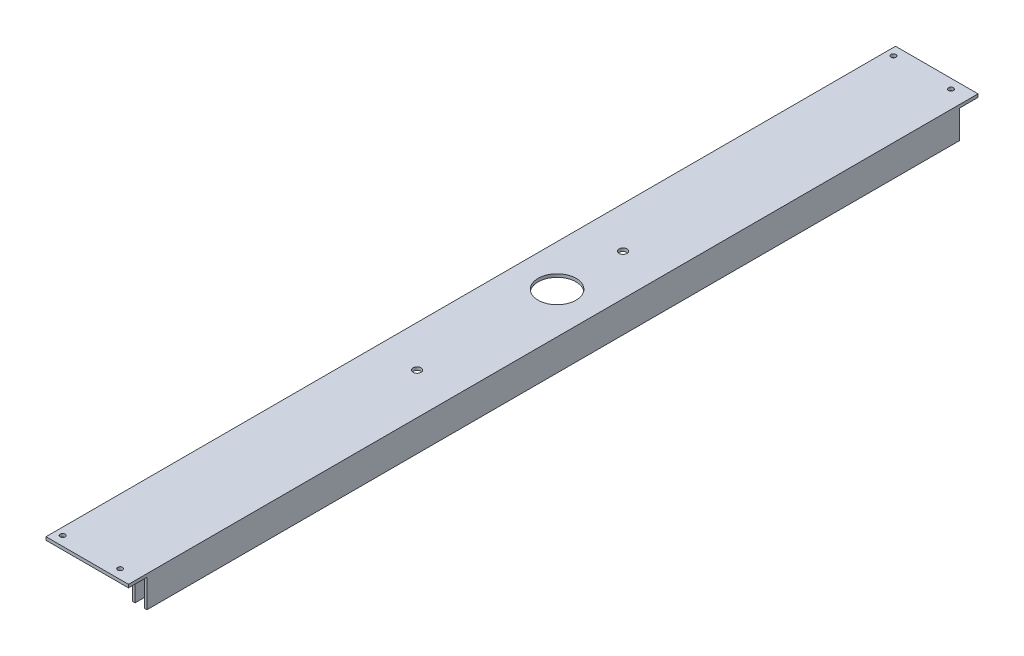
ISO-10303-21;
HEADER;
FILE_DESCRIPTION(('STEP AP214'),'2;1');
FILE_NAME('part.step','',(''),(''),'','','');
FILE_SCHEMA(('AUTOMOTIVE_DESIGN { 1 0 10303 214 1 1 1 1 }'));
ENDSEC;
DATA;
#1=APPLICATION_CONTEXT('core data for automotive mechanical design processes');
#2=APPLICATION_PROTOCOL_DEFINITION('international standard','automotive_design',2000,#1);
#3=PRODUCT_CONTEXT('',#1,'mechanical');
#4=PRODUCT('Part','Part','',(#3));
#5=PRODUCT_RELATED_PRODUCT_CATEGORY('part','',(#4));
#6=PRODUCT_DEFINITION_FORMATION('','',#4);
#7=PRODUCT_DEFINITION_CONTEXT('part definition',#1,'design');
#8=PRODUCT_DEFINITION('design','',#6,#7);
#9=PRODUCT_DEFINITION_SHAPE('','',#8);
#10=(LENGTH_UNIT() NAMED_UNIT(*) SI_UNIT(.MILLI.,.METRE.));
#11=(NAMED_UNIT(*) PLANE_ANGLE_UNIT() SI_UNIT($,.RADIAN.));
#12=(NAMED_UNIT(*) SI_UNIT($,.STERADIAN.) SOLID_ANGLE_UNIT());
#13=UNCERTAINTY_MEASURE_WITH_UNIT(LENGTH_MEASURE(1.E-05),#10,'distance_accuracy_value','');
#14=(GEOMETRIC_REPRESENTATION_CONTEXT(3) GLOBAL_UNCERTAINTY_ASSIGNED_CONTEXT((#13)) GLOBAL_UNIT_ASSIGNED_CONTEXT((#10,
#11,#12)) REPRESENTATION_CONTEXT('',''));
#15=CARTESIAN_POINT('',(0.,0.,0.));
#16=DIRECTION('',(0.,0.,1.));
#17=DIRECTION('',(1.,0.,0.));
#18=AXIS2_PLACEMENT_3D('',#15,#16,#17);
#19=CARTESIAN_POINT('',(-14.9787289884313,281.999999999999,-246.3325));
#20=DIRECTION('',(0.,0.,1.));
#21=DIRECTION('',(1.,0.,0.));
#22=AXIS2_PLACEMENT_3D('',#19,#20,#21);
#23=PLANE('',#22);
#24=DIRECTION('',(1.,0.,0.));
#25=VECTOR('',#24,1.);
#26=CARTESIAN_POINT('',(-22.1787289884313,264.930896236257,-246.3325));
#27=LINE('',#26,#25);
#28=CARTESIAN_POINT('',(-23.6787289884313,264.930896236257,-246.3325));
#29=VERTEX_POINT('',#28);
#30=CARTESIAN_POINT('',(-22.1787289884313,264.930896236257,-246.3325));
#31=VERTEX_POINT('',#30);
#32=EDGE_CURVE('E109',#29,#31,#27,.T.);
#33=ORIENTED_EDGE('',*,*,#32,.F.);
#34=DIRECTION('',(0.,1.,0.));
#35=VECTOR('',#34,1.);
#36=CARTESIAN_POINT('',(-23.6787289884313,264.930896236257,-246.3325));
#37=LINE('',#36,#35);
#38=CARTESIAN_POINT('',(-23.6787289884313,281.999999999999,-246.3325));
#39=VERTEX_POINT('',#38);
#40=EDGE_CURVE('E111',#39,#29,#37,.F.);
#41=ORIENTED_EDGE('',*,*,#40,.F.);
#42=DIRECTION('',(1.,0.,0.));
#43=VECTOR('',#42,1.);
#44=CARTESIAN_POINT('',(-14.9787289884313,281.999999999999,-246.3325));
#45=LINE('',#44,#43);
#46=CARTESIAN_POINT('',(-22.1787289884313,281.999999999999,-246.3325));
#47=VERTEX_POINT('',#46);
#48=EDGE_CURVE('E133',#47,#39,#45,.F.);
#49=ORIENTED_EDGE('',*,*,#48,.F.);
#50=DIRECTION('',(0.,1.,0.));
#51=VECTOR('',#50,1.);
#52=CARTESIAN_POINT('',(-22.1787289884313,282.,-246.3325));
#53=LINE('',#52,#51);
#54=EDGE_CURVE('E114',#31,#47,#53,.T.);
#55=ORIENTED_EDGE('',*,*,#54,.F.);
#56=EDGE_LOOP('',(#33,#41,#49,#55));
#57=FACE_BOUND('',#56,.T.);
#58=ADVANCED_FACE('F16',(#57),#23,.F.);
#59=CARTESIAN_POINT('',(-14.9787289884313,264.930896236257,246.3325));
#60=DIRECTION('',(0.,0.,-1.));
#61=DIRECTION('',(-1.,0.,0.));
#62=AXIS2_PLACEMENT_3D('',#59,#60,#61);
#63=PLANE('',#62);
#64=DIRECTION('',(1.,0.,0.));
#65=VECTOR('',#64,1.);
#66=CARTESIAN_POINT('',(-22.1787289884313,264.930896236257,246.3325));
#67=LINE('',#66,#65);
#68=CARTESIAN_POINT('',(-22.1787289884313,264.930896236257,246.3325));
#69=VERTEX_POINT('',#68);
#70=CARTESIAN_POINT('',(-23.6787289884313,264.930896236257,246.3325));
#71=VERTEX_POINT('',#70);
#72=EDGE_CURVE('E103',#69,#71,#67,.F.);
#73=ORIENTED_EDGE('',*,*,#72,.F.);
#74=DIRECTION('',(0.,1.,0.));
#75=VECTOR('',#74,1.);
#76=CARTESIAN_POINT('',(-22.1787289884313,282.,246.3325));
#77=LINE('',#76,#75);
#78=CARTESIAN_POINT('',(-22.1787289884313,281.999999999999,246.3325));
#79=VERTEX_POINT('',#78);
#80=EDGE_CURVE('E238',#79,#69,#77,.F.);
#81=ORIENTED_EDGE('',*,*,#80,.F.);
#82=DIRECTION('',(-1.,0.,0.));
#83=VECTOR('',#82,1.);
#84=CARTESIAN_POINT('',(-14.9787289884313,282.,246.3325));
#85=LINE('',#84,#83);
#86=CARTESIAN_POINT('',(-23.6787289884313,282.,246.3325));
#87=VERTEX_POINT('',#86);
#88=EDGE_CURVE('E116',#87,#79,#85,.F.);
#89=ORIENTED_EDGE('',*,*,#88,.F.);
#90=DIRECTION('',(0.,1.,0.));
#91=VECTOR('',#90,1.);
#92=CARTESIAN_POINT('',(-23.6787289884313,264.930896236257,246.3325));
#93=LINE('',#92,#91);
#94=EDGE_CURVE('E123',#71,#87,#93,.T.);
#95=ORIENTED_EDGE('',*,*,#94,.F.);
#96=EDGE_LOOP('',(#73,#81,#89,#95));
#97=FACE_BOUND('',#96,.T.);
#98=ADVANCED_FACE('F249',(#97),#63,.F.);
#99=CARTESIAN_POINT('',(-22.1787289884313,264.930896236257,0.));
#100=DIRECTION('',(0.,-1.,0.));
#101=DIRECTION('',(0.,0.,-1.));
#102=AXIS2_PLACEMENT_3D('',#99,#100,#101);
#103=PLANE('',#102);
#104=ORIENTED_EDGE('',*,*,#72,.T.);
#105=DIRECTION('',(0.,0.,1.));
#106=VECTOR('',#105,1.);
#107=CARTESIAN_POINT('',(-23.6787289884313,264.930896236257,0.));
#108=LINE('',#107,#106);
#109=EDGE_CURVE('E119',#29,#71,#108,.T.);
#110=ORIENTED_EDGE('',*,*,#109,.F.);
#111=ORIENTED_EDGE('',*,*,#32,.T.);
#112=DIRECTION('',(0.,0.,-1.));
#113=VECTOR('',#112,1.);
#114=CARTESIAN_POINT('',(-22.1787289884313,264.930896236257,0.));
#115=LINE('',#114,#113);
#116=EDGE_CURVE('E236',#69,#31,#115,.T.);
#117=ORIENTED_EDGE('',*,*,#116,.F.);
#118=EDGE_LOOP('',(#104,#110,#111,#117));
#119=FACE_BOUND('',#118,.T.);
#120=ADVANCED_FACE('F120',(#119),#103,.T.);
#121=CARTESIAN_POINT('',(-16.4787289884313,264.930896236257,0.));
#122=DIRECTION('',(-1.,0.,0.));
#123=DIRECTION('',(0.,0.,1.));
#124=AXIS2_PLACEMENT_3D('',#121,#122,#123);
#125=PLANE('',#124);
#126=DIRECTION('',(0.,1.,0.));
#127=VECTOR('',#126,1.);
#128=CARTESIAN_POINT('',(-16.4787289884313,264.930896236257,246.3325));
#129=LINE('',#128,#127);
#130=CARTESIAN_POINT('',(-16.4787289884313,264.930896236257,246.3325));
#131=VERTEX_POINT('',#130);
#132=CARTESIAN_POINT('',(-16.4787289884313,282.,246.3325));
#133=VERTEX_POINT('',#132);
#134=EDGE_CURVE('E232',#131,#133,#129,.T.);
#135=ORIENTED_EDGE('',*,*,#134,.T.);
#136=DIRECTION('',(0.,0.,-1.));
#137=VECTOR('',#136,1.);
#138=CARTESIAN_POINT('',(-16.4787289884313,282.,0.));
#139=LINE('',#138,#137);
#140=CARTESIAN_POINT('',(-16.4787289884313,281.999999999999,-246.3325));
#141=VERTEX_POINT('',#140);
#142=EDGE_CURVE('E217',#141,#133,#139,.F.);
#143=ORIENTED_EDGE('',*,*,#142,.F.);
#144=DIRECTION('',(0.,1.,0.));
#145=VECTOR('',#144,1.);
#146=CARTESIAN_POINT('',(-16.4787289884313,281.999999999999,-246.3325));
#147=LINE('',#146,#145);
#148=CARTESIAN_POINT('',(-16.4787289884313,264.930896236257,-246.3325));
#149=VERTEX_POINT('',#148);
#150=EDGE_CURVE('E234',#141,#149,#147,.F.);
#151=ORIENTED_EDGE('',*,*,#150,.T.);
#152=DIRECTION('',(0.,0.,-1.));
#153=VECTOR('',#152,1.);
#154=CARTESIAN_POINT('',(-16.4787289884313,264.930896236257,0.));
#155=LINE('',#154,#153);
#156=EDGE_CURVE('E223',#131,#149,#155,.T.);
#157=ORIENTED_EDGE('',*,*,#156,.F.);
#158=EDGE_LOOP('',(#135,#143,#151,#157));
#159=FACE_BOUND('',#158,.T.);
#160=ADVANCED_FACE('F257',(#159),#125,.T.);
#161=CARTESIAN_POINT('',(-23.6787289884313,264.930896236257,0.));
#162=DIRECTION('',(-1.,0.,0.));
#163=DIRECTION('',(0.,0.,1.));
#164=AXIS2_PLACEMENT_3D('',#161,#162,#163);
#165=PLANE('',#164);
#166=ORIENTED_EDGE('',*,*,#94,.T.);
#167=DIRECTION('',(0.,0.,-1.));
#168=VECTOR('',#167,1.);
#169=CARTESIAN_POINT('',(-23.6787289884313,282.,0.));
#170=LINE('',#169,#168);
#171=EDGE_CURVE('E127',#39,#87,#170,.F.);
#172=ORIENTED_EDGE('',*,*,#171,.F.);
#173=ORIENTED_EDGE('',*,*,#40,.T.);
#174=ORIENTED_EDGE('',*,*,#109,.T.);
#175=EDGE_LOOP('',(#166,#172,#173,#174));
#176=FACE_BOUND('',#175,.T.);
#177=ADVANCED_FACE('F125',(#176),#165,.T.);
#178=CARTESIAN_POINT('',(-22.1787289884313,282.,0.));
#179=DIRECTION('',(1.,0.,0.));
#180=DIRECTION('',(0.,0.,-1.));
#181=AXIS2_PLACEMENT_3D('',#178,#179,#180);
#182=PLANE('',#181);
#183=ORIENTED_EDGE('',*,*,#80,.T.);
#184=ORIENTED_EDGE('',*,*,#116,.T.);
#185=ORIENTED_EDGE('',*,*,#54,.T.);
#186=DIRECTION('',(0.,0.,-1.));
#187=VECTOR('',#186,1.);
#188=CARTESIAN_POINT('',(-22.1787289884313,282.,0.));
#189=LINE('',#188,#187);
#190=EDGE_CURVE('E211',#79,#47,#189,.T.);
#191=ORIENTED_EDGE('',*,*,#190,.F.);
#192=EDGE_LOOP('',(#183,#184,#185,#191));
#193=FACE_BOUND('',#192,.T.);
#194=ADVANCED_FACE('F248',(#193),#182,.T.);
#195=CARTESIAN_POINT('',(-14.9787289884313,281.999999999999,-246.3325));
#196=DIRECTION('',(0.,0.,1.));
#197=DIRECTION('',(1.,0.,0.));
#198=AXIS2_PLACEMENT_3D('',#195,#196,#197);
#199=PLANE('',#198);
#200=DIRECTION('',(1.,0.,0.));
#201=VECTOR('',#200,1.);
#202=CARTESIAN_POINT('',(-23.6787289884313,282.,-246.3325));
#203=LINE('',#202,#201);
#204=CARTESIAN_POINT('',(-14.9787289884313,281.999999999999,-246.3325));
#205=VERTEX_POINT('',#204);
#206=EDGE_CURVE('E220',#205,#141,#203,.F.);
#207=ORIENTED_EDGE('',*,*,#206,.F.);
#208=DIRECTION('',(0.,1.,0.));
#209=VECTOR('',#208,1.);
#210=CARTESIAN_POINT('',(-14.9787289884313,283.9,-246.3325));
#211=LINE('',#210,#209);
#212=CARTESIAN_POINT('',(-14.9787289884313,264.930896236257,-246.3325));
#213=VERTEX_POINT('',#212);
#214=EDGE_CURVE('E206',#213,#205,#211,.T.);
#215=ORIENTED_EDGE('',*,*,#214,.F.);
#216=DIRECTION('',(1.,0.,0.));
#217=VECTOR('',#216,1.);
#218=CARTESIAN_POINT('',(-14.9787289884313,264.930896236257,-246.3325));
#219=LINE('',#218,#217);
#220=EDGE_CURVE('E229',#149,#213,#219,.T.);
#221=ORIENTED_EDGE('',*,*,#220,.F.);
#222=ORIENTED_EDGE('',*,*,#150,.F.);
#223=EDGE_LOOP('',(#207,#215,#221,#222));
#224=FACE_BOUND('',#223,.T.);
#225=ADVANCED_FACE('F296',(#224),#199,.F.);
#226=CARTESIAN_POINT('',(-14.9787289884313,264.930896236257,246.3325));
#227=DIRECTION('',(0.,0.,-1.));
#228=DIRECTION('',(-1.,0.,0.));
#229=AXIS2_PLACEMENT_3D('',#226,#227,#228);
#230=PLANE('',#229);
#231=DIRECTION('',(1.,0.,0.));
#232=VECTOR('',#231,1.);
#233=CARTESIAN_POINT('',(-14.9787289884313,264.930896236257,246.3325));
#234=LINE('',#233,#232);
#235=CARTESIAN_POINT('',(-14.9787289884313,264.930896236257,246.3325));
#236=VERTEX_POINT('',#235);
#237=EDGE_CURVE('E226',#236,#131,#234,.F.);
#238=ORIENTED_EDGE('',*,*,#237,.F.);
#239=DIRECTION('',(0.,1.,0.));
#240=VECTOR('',#239,1.);
#241=CARTESIAN_POINT('',(-14.9787289884313,283.9,246.3325));
#242=LINE('',#241,#240);
#243=CARTESIAN_POINT('',(-14.9787289884313,282.,246.3325));
#244=VERTEX_POINT('',#243);
#245=EDGE_CURVE('E195',#244,#236,#242,.F.);
#246=ORIENTED_EDGE('',*,*,#245,.F.);
#247=DIRECTION('',(1.,0.,0.));
#248=VECTOR('',#247,1.);
#249=CARTESIAN_POINT('',(-23.6787289884313,282.,246.3325));
#250=LINE('',#249,#248);
#251=EDGE_CURVE('E215',#133,#244,#250,.T.);
#252=ORIENTED_EDGE('',*,*,#251,.F.);
#253=ORIENTED_EDGE('',*,*,#134,.F.);
#254=EDGE_LOOP('',(#238,#246,#252,#253));
#255=FACE_BOUND('',#254,.T.);
#256=ADVANCED_FACE('F292',(#255),#230,.F.);
#257=CARTESIAN_POINT('',(-14.9787289884313,264.930896236257,0.));
#258=DIRECTION('',(0.,-1.,0.));
#259=DIRECTION('',(0.,0.,-1.));
#260=AXIS2_PLACEMENT_3D('',#257,#258,#259);
#261=PLANE('',#260);
#262=ORIENTED_EDGE('',*,*,#237,.T.);
#263=ORIENTED_EDGE('',*,*,#156,.T.);
#264=ORIENTED_EDGE('',*,*,#220,.T.);
#265=DIRECTION('',(0.,0.,-1.));
#266=VECTOR('',#265,1.);
#267=CARTESIAN_POINT('',(-14.9787289884313,264.930896236257,0.));
#268=LINE('',#267,#266);
#269=EDGE_CURVE('E192',#236,#213,#268,.T.);
#270=ORIENTED_EDGE('',*,*,#269,.F.);
#271=EDGE_LOOP('',(#262,#263,#264,#270));
#272=FACE_BOUND('',#271,.T.);
#273=ADVANCED_FACE('F288',(#272),#261,.T.);
#274=CARTESIAN_POINT('',(-23.6787289884313,282.,0.));
#275=DIRECTION('',(0.,-1.,0.));
#276=DIRECTION('',(0.,0.,-1.));
#277=AXIS2_PLACEMENT_3D('',#274,#275,#276);
#278=PLANE('',#277);
#279=CARTESIAN_POINT('',(-60.5787289884313,282.,251.8545));
#280=DIRECTION('',(0.,-1.,0.));
#281=DIRECTION('',(0.,0.,-1.));
#282=AXIS2_PLACEMENT_3D('',#279,#280,#281);
#283=CIRCLE('',#282,1.50000000000001);
#284=CARTESIAN_POINT('',(-60.5787289884313,282.,250.3545));
#285=VERTEX_POINT('',#284);
#286=EDGE_CURVE('E163',#285,#285,#283,.F.);
#287=ORIENTED_EDGE('',*,*,#286,.T.);
#288=EDGE_LOOP('',(#287));
#289=FACE_BOUND('',#288,.T.);
#290=CARTESIAN_POINT('',(-25.6787289884313,282.,251.8545));
#291=DIRECTION('',(0.,-1.,0.));
#292=DIRECTION('',(0.,0.,-1.));
#293=AXIS2_PLACEMENT_3D('',#290,#291,#292);
#294=CIRCLE('',#293,1.50000000000001);
#295=CARTESIAN_POINT('',(-25.6787289884313,282.,250.3545));
#296=VERTEX_POINT('',#295);
#297=EDGE_CURVE('E160',#296,#296,#294,.F.);
#298=ORIENTED_EDGE('',*,*,#297,.T.);
#299=EDGE_LOOP('',(#298));
#300=FACE_BOUND('',#299,.T.);
#301=CARTESIAN_POINT('',(-60.5787289884314,282.,-251.8545));
#302=DIRECTION('',(0.,-1.,0.));
#303=DIRECTION('',(0.,0.,-1.));
#304=AXIS2_PLACEMENT_3D('',#301,#302,#303);
#305=CIRCLE('',#304,1.49999999999993);
#306=CARTESIAN_POINT('',(-60.5787289884314,282.,-253.3545));
#307=VERTEX_POINT('',#306);
#308=EDGE_CURVE('E157',#307,#307,#305,.F.);
#309=ORIENTED_EDGE('',*,*,#308,.T.);
#310=EDGE_LOOP('',(#309));
#311=FACE_BOUND('',#310,.T.);
#312=CARTESIAN_POINT('',(-25.6787289884314,282.,-251.8545));
#313=DIRECTION('',(0.,-1.,0.));
#314=DIRECTION('',(0.,0.,-1.));
#315=AXIS2_PLACEMENT_3D('',#312,#313,#314);
#316=CIRCLE('',#315,1.49999999999993);
#317=CARTESIAN_POINT('',(-25.6787289884314,282.,-253.3545));
#318=VERTEX_POINT('',#317);
#319=EDGE_CURVE('E153',#318,#318,#316,.F.);
#320=ORIENTED_EDGE('',*,*,#319,.T.);
#321=EDGE_LOOP('',(#320));
#322=FACE_BOUND('',#321,.T.);
#323=ORIENTED_EDGE('',*,*,#190,.T.);
#324=ORIENTED_EDGE('',*,*,#48,.T.);
#325=ORIENTED_EDGE('',*,*,#171,.T.);
#326=ORIENTED_EDGE('',*,*,#88,.T.);
#327=EDGE_LOOP('',(#323,#324,#325,#326));
#328=FACE_BOUND('',#327,.T.);
#329=CARTESIAN_POINT('',(-39.9787289884313,282.,-27.3329000000001));
#330=DIRECTION('',(0.,-1.,0.));
#331=DIRECTION('',(0.,0.,-1.));
#332=AXIS2_PLACEMENT_3D('',#329,#330,#331);
#333=CIRCLE('',#332,11.5);
#334=CARTESIAN_POINT('',(-39.9787289884313,282.,-38.8329000000001));
#335=VERTEX_POINT('',#334);
#336=EDGE_CURVE('E166',#335,#335,#333,.F.);
#337=ORIENTED_EDGE('',*,*,#336,.T.);
#338=EDGE_LOOP('',(#337));
#339=FACE_BOUND('',#338,.T.);
#340=CARTESIAN_POINT('',(-39.9787289884313,282.,-67.3329000000001));
#341=DIRECTION('',(0.,-1.,0.));
#342=DIRECTION('',(0.,0.,-1.));
#343=AXIS2_PLACEMENT_3D('',#340,#341,#342);
#344=CIRCLE('',#343,2.40000000000001);
#345=CARTESIAN_POINT('',(-39.9787289884313,282.,-69.7329000000002));
#346=VERTEX_POINT('',#345);
#347=EDGE_CURVE('E168',#346,#346,#344,.F.);
#348=ORIENTED_EDGE('',*,*,#347,.T.);
#349=EDGE_LOOP('',(#348));
#350=FACE_BOUND('',#349,.T.);
#351=CARTESIAN_POINT('',(-39.9787289884313,282.,57.5325));
#352=DIRECTION('',(0.,-1.,0.));
#353=DIRECTION('',(0.,0.,-1.));
#354=AXIS2_PLACEMENT_3D('',#351,#352,#353);
#355=CIRCLE('',#354,2.4);
#356=CARTESIAN_POINT('',(-39.9787289884313,282.,55.1325000000001));
#357=VERTEX_POINT('',#356);
#358=EDGE_CURVE('E20',#357,#357,#355,.F.);
#359=ORIENTED_EDGE('',*,*,#358,.T.);
#360=EDGE_LOOP('',(#359));
#361=FACE_BOUND('',#360,.T.);
#362=DIRECTION('',(1.,0.,0.));
#363=VECTOR('',#362,1.);
#364=CARTESIAN_POINT('',(-31.7852297780093,282.,257.5325));
#365=LINE('',#364,#363);
#366=CARTESIAN_POINT('',(-64.9787289884313,282.,257.5325));
#367=VERTEX_POINT('',#366);
#368=CARTESIAN_POINT('',(-14.9787289884313,282.,257.5325));
#369=VERTEX_POINT('',#368);
#370=EDGE_CURVE('E209',#367,#369,#365,.T.);
#371=ORIENTED_EDGE('',*,*,#370,.F.);
#372=DIRECTION('',(0.,0.,1.));
#373=VECTOR('',#372,1.);
#374=CARTESIAN_POINT('',(-64.9787289884313,282.,0.));
#375=LINE('',#374,#373);
#376=CARTESIAN_POINT('',(-64.9787289884313,282.,-257.5325));
#377=VERTEX_POINT('',#376);
#378=EDGE_CURVE('E173',#377,#367,#375,.T.);
#379=ORIENTED_EDGE('',*,*,#378,.F.);
#380=DIRECTION('',(1.,0.,0.));
#381=VECTOR('',#380,1.);
#382=CARTESIAN_POINT('',(-31.7852297780093,282.,-257.5325));
#383=LINE('',#382,#381);
#384=CARTESIAN_POINT('',(-14.9787289884313,281.999999999999,-257.5325));
#385=VERTEX_POINT('',#384);
#386=EDGE_CURVE('E187',#377,#385,#383,.T.);
#387=ORIENTED_EDGE('',*,*,#386,.T.);
#388=DIRECTION('',(0.,0.,-1.));
#389=VECTOR('',#388,1.);
#390=CARTESIAN_POINT('',(-14.9787289884313,281.999999999999,0.));
#391=LINE('',#390,#389);
#392=EDGE_CURVE('E204',#205,#385,#391,.T.);
#393=ORIENTED_EDGE('',*,*,#392,.F.);
#394=ORIENTED_EDGE('',*,*,#206,.T.);
#395=ORIENTED_EDGE('',*,*,#142,.T.);
#396=ORIENTED_EDGE('',*,*,#251,.T.);
#397=DIRECTION('',(0.,0.,-1.));
#398=VECTOR('',#397,1.);
#399=CARTESIAN_POINT('',(-14.9787289884313,282.,0.));
#400=LINE('',#399,#398);
#401=EDGE_CURVE('E198',#369,#244,#400,.T.);
#402=ORIENTED_EDGE('',*,*,#401,.F.);
#403=EDGE_LOOP('',(#371,#379,#387,#393,#394,#395,#396,#402));
#404=FACE_BOUND('',#403,.T.);
#405=ADVANCED_FACE('F243',(#289,#300,#311,#322,#328,#339,#350,#361,#404),#278,.T.);
#406=CARTESIAN_POINT('',(-31.7852297780093,278.889138364981,257.5325));
#407=DIRECTION('',(0.,0.,1.));
#408=DIRECTION('',(1.,0.,0.));
#409=AXIS2_PLACEMENT_3D('',#406,#407,#408);
#410=PLANE('',#409);
#411=DIRECTION('',(1.,0.,0.));
#412=VECTOR('',#411,1.);
#413=CARTESIAN_POINT('',(-64.9787289884313,283.9,257.5325));
#414=LINE('',#413,#412);
#415=CARTESIAN_POINT('',(-64.9787289884313,283.9,257.5325));
#416=VERTEX_POINT('',#415);
#417=CARTESIAN_POINT('',(-14.9787289884313,283.9,257.5325));
#418=VERTEX_POINT('',#417);
#419=EDGE_CURVE('E156',#416,#418,#414,.T.);
#420=ORIENTED_EDGE('',*,*,#419,.F.);
#421=DIRECTION('',(0.,1.,0.));
#422=VECTOR('',#421,1.);
#423=CARTESIAN_POINT('',(-64.9787289884313,282.,257.5325));
#424=LINE('',#423,#422);
#425=EDGE_CURVE('E181',#367,#416,#424,.T.);
#426=ORIENTED_EDGE('',*,*,#425,.F.);
#427=ORIENTED_EDGE('',*,*,#370,.T.);
#428=DIRECTION('',(0.,1.,0.));
#429=VECTOR('',#428,1.);
#430=CARTESIAN_POINT('',(-14.9787289884313,283.9,257.5325));
#431=LINE('',#430,#429);
#432=EDGE_CURVE('E201',#418,#369,#431,.F.);
#433=ORIENTED_EDGE('',*,*,#432,.F.);
#434=EDGE_LOOP('',(#420,#426,#427,#433));
#435=FACE_BOUND('',#434,.T.);
#436=ADVANCED_FACE('F281',(#435),#410,.T.);
#437=CARTESIAN_POINT('',(-14.9787289884313,283.9,0.));
#438=DIRECTION('',(1.,0.,0.));
#439=DIRECTION('',(0.,0.,-1.));
#440=AXIS2_PLACEMENT_3D('',#437,#438,#439);
#441=PLANE('',#440);
#442=ORIENTED_EDGE('',*,*,#245,.T.);
#443=ORIENTED_EDGE('',*,*,#269,.T.);
#444=ORIENTED_EDGE('',*,*,#214,.T.);
#445=ORIENTED_EDGE('',*,*,#392,.T.);
#446=DIRECTION('',(0.,1.,0.));
#447=VECTOR('',#446,1.);
#448=CARTESIAN_POINT('',(-14.9787289884313,278.889138364981,-257.5325));
#449=LINE('',#448,#447);
#450=CARTESIAN_POINT('',(-14.9787289884313,283.9,-257.5325));
#451=VERTEX_POINT('',#450);
#452=EDGE_CURVE('E190',#385,#451,#449,.T.);
#453=ORIENTED_EDGE('',*,*,#452,.T.);
#454=DIRECTION('',(0.,0.,1.));
#455=VECTOR('',#454,1.);
#456=CARTESIAN_POINT('',(-14.9787289884313,283.9,0.));
#457=LINE('',#456,#455);
#458=EDGE_CURVE('E327',#418,#451,#457,.F.);
#459=ORIENTED_EDGE('',*,*,#458,.F.);
#460=ORIENTED_EDGE('',*,*,#432,.T.);
#461=ORIENTED_EDGE('',*,*,#401,.T.);
#462=EDGE_LOOP('',(#442,#443,#444,#445,#453,#459,#460,#461));
#463=FACE_BOUND('',#462,.T.);
#464=ADVANCED_FACE('F278',(#463),#441,.T.);
#465=CARTESIAN_POINT('',(-31.7852297780093,278.889138364981,-257.5325));
#466=DIRECTION('',(0.,0.,1.));
#467=DIRECTION('',(1.,0.,0.));
#468=AXIS2_PLACEMENT_3D('',#465,#466,#467);
#469=PLANE('',#468);
#470=DIRECTION('',(0.,1.,0.));
#471=VECTOR('',#470,1.);
#472=CARTESIAN_POINT('',(-64.9787289884313,282.,-257.5325));
#473=LINE('',#472,#471);
#474=CARTESIAN_POINT('',(-64.9787289884313,283.9,-257.5325));
#475=VERTEX_POINT('',#474);
#476=EDGE_CURVE('E35',#475,#377,#473,.F.);
#477=ORIENTED_EDGE('',*,*,#476,.F.);
#478=DIRECTION('',(1.,0.,0.));
#479=VECTOR('',#478,1.);
#480=CARTESIAN_POINT('',(-64.9787289884313,283.9,-257.5325));
#481=LINE('',#480,#479);
#482=EDGE_CURVE('E325',#451,#475,#481,.F.);
#483=ORIENTED_EDGE('',*,*,#482,.F.);
#484=ORIENTED_EDGE('',*,*,#452,.F.);
#485=ORIENTED_EDGE('',*,*,#386,.F.);
#486=EDGE_LOOP('',(#477,#483,#484,#485));
#487=FACE_BOUND('',#486,.T.);
#488=ADVANCED_FACE('F275',(#487),#469,.F.);
#489=CARTESIAN_POINT('',(-64.9787289884313,282.,0.));
#490=DIRECTION('',(-1.,0.,0.));
#491=DIRECTION('',(0.,0.,1.));
#492=AXIS2_PLACEMENT_3D('',#489,#490,#491);
#493=PLANE('',#492);
#494=ORIENTED_EDGE('',*,*,#476,.T.);
#495=ORIENTED_EDGE('',*,*,#378,.T.);
#496=ORIENTED_EDGE('',*,*,#425,.T.);
#497=DIRECTION('',(0.,0.,1.));
#498=VECTOR('',#497,1.);
#499=CARTESIAN_POINT('',(-64.9787289884313,283.9,0.));
#500=LINE('',#499,#498);
#501=EDGE_CURVE('E152',#475,#416,#500,.T.);
#502=ORIENTED_EDGE('',*,*,#501,.F.);
#503=EDGE_LOOP('',(#494,#495,#496,#502));
#504=FACE_BOUND('',#503,.T.);
#505=ADVANCED_FACE('F271',(#504),#493,.T.);
#506=CARTESIAN_POINT('',(-39.9787289884313,283.9,57.5325));
#507=DIRECTION('',(0.,-1.,0.));
#508=DIRECTION('',(0.,0.,-1.));
#509=AXIS2_PLACEMENT_3D('',#506,#507,#508);
#510=CYLINDRICAL_SURFACE('',#509,2.4);
#511=CARTESIAN_POINT('',(-39.9787289884313,283.9,57.5325));
#512=DIRECTION('',(0.,-1.,0.));
#513=DIRECTION('',(0.,0.,-1.));
#514=AXIS2_PLACEMENT_3D('',#511,#512,#513);
#515=CIRCLE('',#514,2.4);
#516=CARTESIAN_POINT('',(-39.9787289884313,283.9,55.1325000000001));
#517=VERTEX_POINT('',#516);
#518=EDGE_CURVE('E149',#517,#517,#515,.T.);
#519=ORIENTED_EDGE('',*,*,#518,.F.);
#520=EDGE_LOOP('',(#519));
#521=FACE_BOUND('',#520,.T.);
#522=ORIENTED_EDGE('',*,*,#358,.F.);
#523=EDGE_LOOP('',(#522));
#524=FACE_BOUND('',#523,.T.);
#525=ADVANCED_FACE('F274',(#521,#524),#510,.F.);
#526=CARTESIAN_POINT('',(-39.9787289884313,283.9,-67.3329000000001));
#527=DIRECTION('',(0.,-1.,0.));
#528=DIRECTION('',(0.,0.,-1.));
#529=AXIS2_PLACEMENT_3D('',#526,#527,#528);
#530=CYLINDRICAL_SURFACE('',#529,2.40000000000001);
#531=CARTESIAN_POINT('',(-39.9787289884313,283.9,-67.3329000000001));
#532=DIRECTION('',(0.,-1.,0.));
#533=DIRECTION('',(0.,0.,-1.));
#534=AXIS2_PLACEMENT_3D('',#531,#532,#533);
#535=CIRCLE('',#534,2.40000000000001);
#536=CARTESIAN_POINT('',(-39.9787289884313,283.9,-69.7329000000002));
#537=VERTEX_POINT('',#536);
#538=EDGE_CURVE('E146',#537,#537,#535,.T.);
#539=ORIENTED_EDGE('',*,*,#538,.F.);
#540=EDGE_LOOP('',(#539));
#541=FACE_BOUND('',#540,.T.);
#542=ORIENTED_EDGE('',*,*,#347,.F.);
#543=EDGE_LOOP('',(#542));
#544=FACE_BOUND('',#543,.T.);
#545=ADVANCED_FACE('F381',(#541,#544),#530,.F.);
#546=CARTESIAN_POINT('',(-39.9787289884313,283.9,-27.3329000000001));
#547=DIRECTION('',(0.,-1.,0.));
#548=DIRECTION('',(0.,0.,-1.));
#549=AXIS2_PLACEMENT_3D('',#546,#547,#548);
#550=CYLINDRICAL_SURFACE('',#549,11.5);
#551=CARTESIAN_POINT('',(-39.9787289884313,283.9,-27.3329000000001));
#552=DIRECTION('',(0.,-1.,0.));
#553=DIRECTION('',(0.,0.,-1.));
#554=AXIS2_PLACEMENT_3D('',#551,#552,#553);
#555=CIRCLE('',#554,11.5);
#556=CARTESIAN_POINT('',(-39.9787289884313,283.9,-38.8329000000001));
#557=VERTEX_POINT('',#556);
#558=EDGE_CURVE('E143',#557,#557,#555,.T.);
#559=ORIENTED_EDGE('',*,*,#558,.F.);
#560=EDGE_LOOP('',(#559));
#561=FACE_BOUND('',#560,.T.);
#562=ORIENTED_EDGE('',*,*,#336,.F.);
#563=EDGE_LOOP('',(#562));
#564=FACE_BOUND('',#563,.T.);
#565=ADVANCED_FACE('F389',(#561,#564),#550,.F.);
#566=CARTESIAN_POINT('',(-60.5787289884313,283.9,251.8545));
#567=DIRECTION('',(0.,-1.,0.));
#568=DIRECTION('',(0.,0.,-1.));
#569=AXIS2_PLACEMENT_3D('',#566,#567,#568);
#570=CYLINDRICAL_SURFACE('',#569,1.50000000000001);
#571=CARTESIAN_POINT('',(-60.5787289884313,283.9,251.8545));
#572=DIRECTION('',(0.,-1.,0.));
#573=DIRECTION('',(0.,0.,-1.));
#574=AXIS2_PLACEMENT_3D('',#571,#572,#573);
#575=CIRCLE('',#574,1.50000000000001);
#576=CARTESIAN_POINT('',(-60.5787289884313,283.9,250.3545));
#577=VERTEX_POINT('',#576);
#578=EDGE_CURVE('E140',#577,#577,#575,.T.);
#579=ORIENTED_EDGE('',*,*,#578,.F.);
#580=EDGE_LOOP('',(#579));
#581=FACE_BOUND('',#580,.T.);
#582=ORIENTED_EDGE('',*,*,#286,.F.);
#583=EDGE_LOOP('',(#582));
#584=FACE_BOUND('',#583,.T.);
#585=ADVANCED_FACE('F397',(#581,#584),#570,.F.);
#586=CARTESIAN_POINT('',(-25.6787289884313,283.9,251.8545));
#587=DIRECTION('',(0.,-1.,0.));
#588=DIRECTION('',(0.,0.,-1.));
#589=AXIS2_PLACEMENT_3D('',#586,#587,#588);
#590=CYLINDRICAL_SURFACE('',#589,1.50000000000001);
#591=CARTESIAN_POINT('',(-25.6787289884313,283.9,251.8545));
#592=DIRECTION('',(0.,-1.,0.));
#593=DIRECTION('',(0.,0.,-1.));
#594=AXIS2_PLACEMENT_3D('',#591,#592,#593);
#595=CIRCLE('',#594,1.50000000000001);
#596=CARTESIAN_POINT('',(-25.6787289884313,283.9,250.3545));
#597=VERTEX_POINT('',#596);
#598=EDGE_CURVE('E137',#597,#597,#595,.T.);
#599=ORIENTED_EDGE('',*,*,#598,.F.);
#600=EDGE_LOOP('',(#599));
#601=FACE_BOUND('',#600,.T.);
#602=ORIENTED_EDGE('',*,*,#297,.F.);
#603=EDGE_LOOP('',(#602));
#604=FACE_BOUND('',#603,.T.);
#605=ADVANCED_FACE('F405',(#601,#604),#590,.F.);
#606=CARTESIAN_POINT('',(-60.5787289884314,283.9,-251.8545));
#607=DIRECTION('',(0.,-1.,0.));
#608=DIRECTION('',(0.,0.,-1.));
#609=AXIS2_PLACEMENT_3D('',#606,#607,#608);
#610=CYLINDRICAL_SURFACE('',#609,1.49999999999993);
#611=CARTESIAN_POINT('',(-60.5787289884314,283.9,-251.8545));
#612=DIRECTION('',(0.,-1.,0.));
#613=DIRECTION('',(0.,0.,-1.));
#614=AXIS2_PLACEMENT_3D('',#611,#612,#613);
#615=CIRCLE('',#614,1.49999999999993);
#616=CARTESIAN_POINT('',(-60.5787289884314,283.9,-253.3545));
#617=VERTEX_POINT('',#616);
#618=EDGE_CURVE('E26',#617,#617,#615,.T.);
#619=ORIENTED_EDGE('',*,*,#618,.F.);
#620=EDGE_LOOP('',(#619));
#621=FACE_BOUND('',#620,.T.);
#622=ORIENTED_EDGE('',*,*,#308,.F.);
#623=EDGE_LOOP('',(#622));
#624=FACE_BOUND('',#623,.T.);
#625=ADVANCED_FACE('F267',(#621,#624),#610,.F.);
#626=CARTESIAN_POINT('',(-25.6787289884314,283.9,-251.8545));
#627=DIRECTION('',(0.,-1.,0.));
#628=DIRECTION('',(0.,0.,-1.));
#629=AXIS2_PLACEMENT_3D('',#626,#627,#628);
#630=CYLINDRICAL_SURFACE('',#629,1.49999999999993);
#631=CARTESIAN_POINT('',(-25.6787289884314,283.9,-251.8545));
#632=DIRECTION('',(0.,-1.,0.));
#633=DIRECTION('',(0.,0.,-1.));
#634=AXIS2_PLACEMENT_3D('',#631,#632,#633);
#635=CIRCLE('',#634,1.49999999999993);
#636=CARTESIAN_POINT('',(-25.6787289884314,283.9,-253.3545));
#637=VERTEX_POINT('',#636);
#638=EDGE_CURVE('E10',#637,#637,#635,.T.);
#639=ORIENTED_EDGE('',*,*,#638,.F.);
#640=EDGE_LOOP('',(#639));
#641=FACE_BOUND('',#640,.T.);
#642=ORIENTED_EDGE('',*,*,#319,.F.);
#643=EDGE_LOOP('',(#642));
#644=FACE_BOUND('',#643,.T.);
#645=ADVANCED_FACE('F18',(#641,#644),#630,.F.);
#646=CARTESIAN_POINT('',(-64.9787289884313,283.9,0.));
#647=DIRECTION('',(0.,1.,0.));
#648=DIRECTION('',(0.,0.,1.));
#649=AXIS2_PLACEMENT_3D('',#646,#647,#648);
#650=PLANE('',#649);
#651=ORIENTED_EDGE('',*,*,#638,.T.);
#652=EDGE_LOOP('',(#651));
#653=FACE_BOUND('',#652,.T.);
#654=ORIENTED_EDGE('',*,*,#618,.T.);
#655=EDGE_LOOP('',(#654));
#656=FACE_BOUND('',#655,.T.);
#657=ORIENTED_EDGE('',*,*,#598,.T.);
#658=EDGE_LOOP('',(#657));
#659=FACE_BOUND('',#658,.T.);
#660=ORIENTED_EDGE('',*,*,#578,.T.);
#661=EDGE_LOOP('',(#660));
#662=FACE_BOUND('',#661,.T.);
#663=ORIENTED_EDGE('',*,*,#558,.T.);
#664=EDGE_LOOP('',(#663));
#665=FACE_BOUND('',#664,.T.);
#666=ORIENTED_EDGE('',*,*,#538,.T.);
#667=EDGE_LOOP('',(#666));
#668=FACE_BOUND('',#667,.T.);
#669=ORIENTED_EDGE('',*,*,#518,.T.);
#670=EDGE_LOOP('',(#669));
#671=FACE_BOUND('',#670,.T.);
#672=ORIENTED_EDGE('',*,*,#482,.T.);
#673=ORIENTED_EDGE('',*,*,#501,.T.);
#674=ORIENTED_EDGE('',*,*,#419,.T.);
#675=ORIENTED_EDGE('',*,*,#458,.T.);
#676=EDGE_LOOP('',(#672,#673,#674,#675));
#677=FACE_BOUND('',#676,.T.);
#678=ADVANCED_FACE('F260',(#653,#656,#659,#662,#665,#668,#671,#677),#650,.T.);
#679=CLOSED_SHELL('',(#58,#98,#120,#160,#177,#194,#225,#256,#273,#405,#436,#464,#488,#505,#525,
#545,#565,#585,#605,#625,#645,#678));
#680=MANIFOLD_SOLID_BREP('B1',#679);
#681=ADVANCED_BREP_SHAPE_REPRESENTATION('',(#18,#680),#14);
#682=SHAPE_DEFINITION_REPRESENTATION(#9,#681);
ENDSEC;
END-ISO-10303-21;
